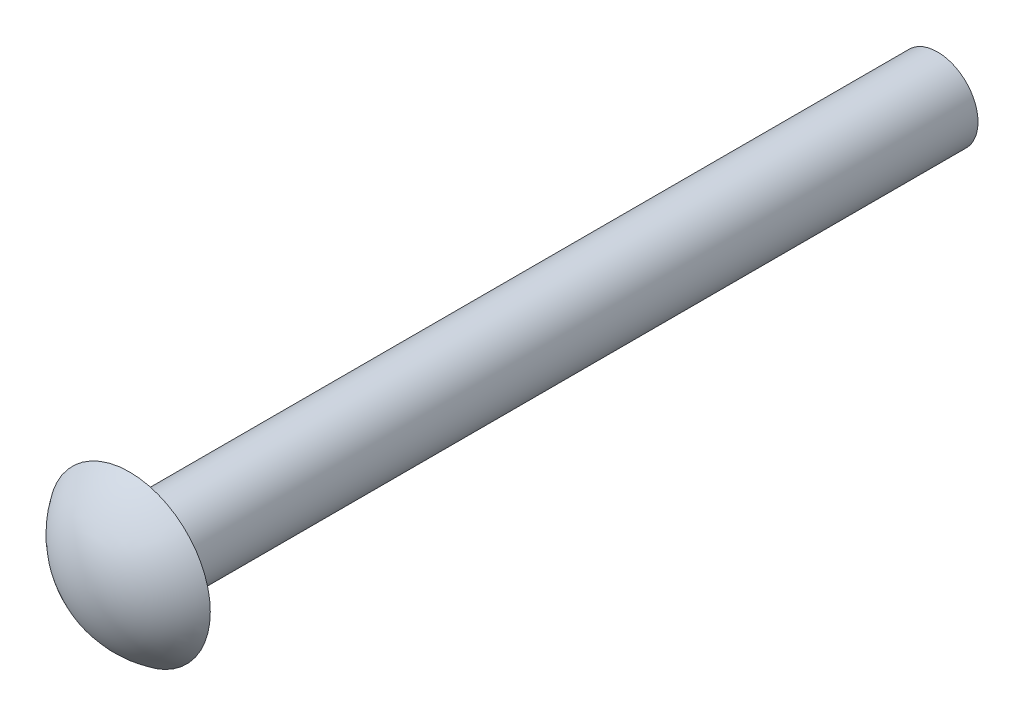
ISO-10303-21;
HEADER;
FILE_DESCRIPTION(('STEP AP214'),'2;1');
FILE_NAME('part.step','',(''),(''),'','','');
FILE_SCHEMA(('AUTOMOTIVE_DESIGN { 1 0 10303 214 1 1 1 1 }'));
ENDSEC;
DATA;
#1=APPLICATION_CONTEXT('core data for automotive mechanical design processes');
#2=APPLICATION_PROTOCOL_DEFINITION('international standard','automotive_design',2000,#1);
#3=PRODUCT_CONTEXT('',#1,'mechanical');
#4=PRODUCT('Part','Part','',(#3));
#5=PRODUCT_RELATED_PRODUCT_CATEGORY('part','',(#4));
#6=PRODUCT_DEFINITION_FORMATION('','',#4);
#7=PRODUCT_DEFINITION_CONTEXT('part definition',#1,'design');
#8=PRODUCT_DEFINITION('design','',#6,#7);
#9=PRODUCT_DEFINITION_SHAPE('','',#8);
#10=(LENGTH_UNIT() NAMED_UNIT(*) SI_UNIT(.MILLI.,.METRE.));
#11=(NAMED_UNIT(*) PLANE_ANGLE_UNIT() SI_UNIT($,.RADIAN.));
#12=(NAMED_UNIT(*) SI_UNIT($,.STERADIAN.) SOLID_ANGLE_UNIT());
#13=UNCERTAINTY_MEASURE_WITH_UNIT(LENGTH_MEASURE(1.E-05),#10,'distance_accuracy_value','');
#14=(GEOMETRIC_REPRESENTATION_CONTEXT(3) GLOBAL_UNCERTAINTY_ASSIGNED_CONTEXT((#13)) GLOBAL_UNIT_ASSIGNED_CONTEXT((#10,
#11,#12)) REPRESENTATION_CONTEXT('',''));
#15=CARTESIAN_POINT('',(0.,0.,0.));
#16=DIRECTION('',(0.,0.,1.));
#17=DIRECTION('',(1.,0.,0.));
#18=AXIS2_PLACEMENT_3D('',#15,#16,#17);
#19=CARTESIAN_POINT('',(0.,0.,0.));
#20=DIRECTION('',(0.,0.,1.));
#21=DIRECTION('',(1.,0.,0.));
#22=AXIS2_PLACEMENT_3D('',#19,#20,#21);
#23=PLANE('',#22);
#24=CARTESIAN_POINT('',(0.,0.,0.));
#25=DIRECTION('',(0.,0.,1.));
#26=DIRECTION('',(1.,0.,0.));
#27=AXIS2_PLACEMENT_3D('',#24,#25,#26);
#28=CIRCLE('',#27,0.635);
#29=CARTESIAN_POINT('',(0.635,0.,0.));
#30=VERTEX_POINT('',#29);
#31=EDGE_CURVE('E10',#30,#30,#28,.F.);
#32=ORIENTED_EDGE('',*,*,#31,.F.);
#33=EDGE_LOOP('',(#32));
#34=FACE_BOUND('',#33,.T.);
#35=CARTESIAN_POINT('',(0.,0.,0.));
#36=DIRECTION('',(0.,0.,1.));
#37=DIRECTION('',(1.,0.,0.));
#38=AXIS2_PLACEMENT_3D('',#35,#36,#37);
#39=CIRCLE('',#38,1.27);
#40=CARTESIAN_POINT('',(1.27,0.,0.));
#41=VERTEX_POINT('',#40);
#42=EDGE_CURVE('E45',#41,#41,#39,.T.);
#43=ORIENTED_EDGE('',*,*,#42,.F.);
#44=EDGE_LOOP('',(#43));
#45=FACE_BOUND('',#44,.T.);
#46=ADVANCED_FACE('F39',(#34,#45),#23,.F.);
#47=CARTESIAN_POINT('',(0.,0.,-0.842422696750271));
#48=DIRECTION('',(0.,0.,1.));
#49=DIRECTION('',(0.,1.,0.));
#50=AXIS2_PLACEMENT_3D('',#47,#48,#49);
#51=SPHERICAL_SURFACE('',#50,1.524);
#52=ORIENTED_EDGE('',*,*,#42,.T.);
#53=EDGE_LOOP('',(#52));
#54=FACE_BOUND('',#53,.T.);
#55=ADVANCED_FACE('F60',(#54),#51,.T.);
#56=CARTESIAN_POINT('',(0.,0.,-12.7));
#57=DIRECTION('',(0.,0.,1.));
#58=DIRECTION('',(1.,0.,0.));
#59=AXIS2_PLACEMENT_3D('',#56,#57,#58);
#60=CYLINDRICAL_SURFACE('',#59,0.635);
#61=CARTESIAN_POINT('',(0.,0.,-12.7));
#62=DIRECTION('',(0.,0.,-1.));
#63=DIRECTION('',(-1.,0.,0.));
#64=AXIS2_PLACEMENT_3D('',#61,#62,#63);
#65=CIRCLE('',#64,0.635);
#66=CARTESIAN_POINT('',(-0.635,0.,-12.7));
#67=VERTEX_POINT('',#66);
#68=EDGE_CURVE('E49',#67,#67,#65,.T.);
#69=ORIENTED_EDGE('',*,*,#68,.F.);
#70=EDGE_LOOP('',(#69));
#71=FACE_BOUND('',#70,.T.);
#72=ORIENTED_EDGE('',*,*,#31,.T.);
#73=EDGE_LOOP('',(#72));
#74=FACE_BOUND('',#73,.T.);
#75=ADVANCED_FACE('F58',(#71,#74),#60,.T.);
#76=CARTESIAN_POINT('',(0.,0.,-12.7));
#77=DIRECTION('',(0.,0.,-1.));
#78=DIRECTION('',(-1.,0.,0.));
#79=AXIS2_PLACEMENT_3D('',#76,#77,#78);
#80=PLANE('',#79);
#81=ORIENTED_EDGE('',*,*,#68,.T.);
#82=EDGE_LOOP('',(#81));
#83=FACE_BOUND('',#82,.T.);
#84=ADVANCED_FACE('F56',(#83),#80,.T.);
#85=CLOSED_SHELL('',(#46,#55,#75,#84));
#86=MANIFOLD_SOLID_BREP('B2',#85);
#87=ADVANCED_BREP_SHAPE_REPRESENTATION('',(#18,#86),#14);
#88=SHAPE_DEFINITION_REPRESENTATION(#9,#87);
ENDSEC;
END-ISO-10303-21;
